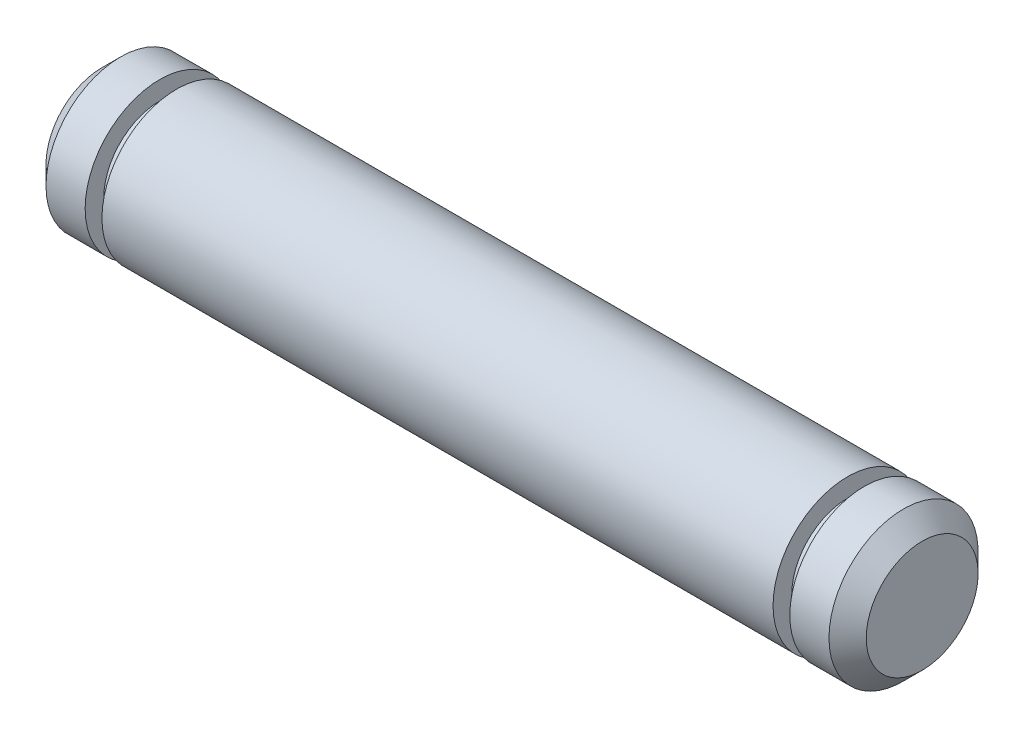
ISO-10303-21;
HEADER;
FILE_DESCRIPTION(('STEP AP214'),'2;1');
FILE_NAME('part.step','',(''),(''),'','','');
FILE_SCHEMA(('AUTOMOTIVE_DESIGN { 1 0 10303 214 1 1 1 1 }'));
ENDSEC;
DATA;
#1=APPLICATION_CONTEXT('core data for automotive mechanical design processes');
#2=APPLICATION_PROTOCOL_DEFINITION('international standard','automotive_design',2000,#1);
#3=PRODUCT_CONTEXT('',#1,'mechanical');
#4=PRODUCT('Part','Part','',(#3));
#5=PRODUCT_RELATED_PRODUCT_CATEGORY('part','',(#4));
#6=PRODUCT_DEFINITION_FORMATION('','',#4);
#7=PRODUCT_DEFINITION_CONTEXT('part definition',#1,'design');
#8=PRODUCT_DEFINITION('design','',#6,#7);
#9=PRODUCT_DEFINITION_SHAPE('','',#8);
#10=(LENGTH_UNIT() NAMED_UNIT(*) SI_UNIT(.MILLI.,.METRE.));
#11=(NAMED_UNIT(*) PLANE_ANGLE_UNIT() SI_UNIT($,.RADIAN.));
#12=(NAMED_UNIT(*) SI_UNIT($,.STERADIAN.) SOLID_ANGLE_UNIT());
#13=UNCERTAINTY_MEASURE_WITH_UNIT(LENGTH_MEASURE(1.E-05),#10,'distance_accuracy_value','');
#14=(GEOMETRIC_REPRESENTATION_CONTEXT(3) GLOBAL_UNCERTAINTY_ASSIGNED_CONTEXT((#13)) GLOBAL_UNIT_ASSIGNED_CONTEXT((#10,
#11,#12)) REPRESENTATION_CONTEXT('',''));
#15=CARTESIAN_POINT('',(0.,0.,0.));
#16=DIRECTION('',(0.,0.,1.));
#17=DIRECTION('',(1.,0.,0.));
#18=AXIS2_PLACEMENT_3D('',#15,#16,#17);
#19=CARTESIAN_POINT('',(0.,0.,0.));
#20=DIRECTION('',(1.,0.,0.));
#21=DIRECTION('',(0.,0.,-1.));
#22=AXIS2_PLACEMENT_3D('',#19,#20,#21);
#23=PLANE('',#22);
#24=CARTESIAN_POINT('',(0.,0.,0.));
#25=DIRECTION('',(1.,0.,0.));
#26=DIRECTION('',(0.,0.,-1.));
#27=AXIS2_PLACEMENT_3D('',#24,#25,#26);
#28=CIRCLE('',#27,3.);
#29=CARTESIAN_POINT('',(0.,0.,-3.));
#30=VERTEX_POINT('',#29);
#31=EDGE_CURVE('E66',#30,#30,#28,.F.);
#32=ORIENTED_EDGE('',*,*,#31,.T.);
#33=EDGE_LOOP('',(#32));
#34=FACE_BOUND('',#33,.T.);
#35=ADVANCED_FACE('F45',(#34),#23,.F.);
#36=CARTESIAN_POINT('',(0.,0.,0.));
#37=DIRECTION('',(-1.,0.,0.));
#38=DIRECTION('',(0.,0.,1.));
#39=AXIS2_PLACEMENT_3D('',#36,#37,#38);
#40=CYLINDRICAL_SURFACE('',#39,4.);
#41=CARTESIAN_POINT('',(1.,0.,0.));
#42=DIRECTION('',(1.,0.,0.));
#43=DIRECTION('',(0.,0.,-1.));
#44=AXIS2_PLACEMENT_3D('',#41,#42,#43);
#45=CIRCLE('',#44,4.);
#46=CARTESIAN_POINT('',(1.,0.,-4.));
#47=VERTEX_POINT('',#46);
#48=EDGE_CURVE('E60',#47,#47,#45,.T.);
#49=ORIENTED_EDGE('',*,*,#48,.T.);
#50=EDGE_LOOP('',(#49));
#51=FACE_BOUND('',#50,.T.);
#52=CARTESIAN_POINT('',(3.1,0.,0.));
#53=DIRECTION('',(-1.,0.,0.));
#54=DIRECTION('',(0.,0.,1.));
#55=AXIS2_PLACEMENT_3D('',#52,#53,#54);
#56=CIRCLE('',#55,4.);
#57=CARTESIAN_POINT('',(3.1,0.,4.));
#58=VERTEX_POINT('',#57);
#59=EDGE_CURVE('E72',#58,#58,#56,.T.);
#60=ORIENTED_EDGE('',*,*,#59,.T.);
#61=EDGE_LOOP('',(#60));
#62=FACE_BOUND('',#61,.T.);
#63=ADVANCED_FACE('F122',(#51,#62),#40,.T.);
#64=CARTESIAN_POINT('',(3.1,4.,0.));
#65=DIRECTION('',(-1.,0.,0.));
#66=DIRECTION('',(0.,0.,1.));
#67=AXIS2_PLACEMENT_3D('',#64,#65,#66);
#68=PLANE('',#67);
#69=ORIENTED_EDGE('',*,*,#59,.F.);
#70=EDGE_LOOP('',(#69));
#71=FACE_BOUND('',#70,.T.);
#72=CARTESIAN_POINT('',(3.1,0.,0.));
#73=DIRECTION('',(-1.,0.,0.));
#74=DIRECTION('',(0.,0.,1.));
#75=AXIS2_PLACEMENT_3D('',#72,#73,#74);
#76=CIRCLE('',#75,3.);
#77=CARTESIAN_POINT('',(3.1,0.,3.));
#78=VERTEX_POINT('',#77);
#79=EDGE_CURVE('E76',#78,#78,#76,.T.);
#80=ORIENTED_EDGE('',*,*,#79,.T.);
#81=EDGE_LOOP('',(#80));
#82=FACE_BOUND('',#81,.T.);
#83=ADVANCED_FACE('F128',(#71,#82),#68,.F.);
#84=CARTESIAN_POINT('',(0.,0.,0.));
#85=DIRECTION('',(-1.,0.,0.));
#86=DIRECTION('',(0.,0.,1.));
#87=AXIS2_PLACEMENT_3D('',#84,#85,#86);
#88=CYLINDRICAL_SURFACE('',#87,3.);
#89=ORIENTED_EDGE('',*,*,#79,.F.);
#90=EDGE_LOOP('',(#89));
#91=FACE_BOUND('',#90,.T.);
#92=CARTESIAN_POINT('',(4.,0.,0.));
#93=DIRECTION('',(-1.,0.,0.));
#94=DIRECTION('',(0.,0.,1.));
#95=AXIS2_PLACEMENT_3D('',#92,#93,#94);
#96=CIRCLE('',#95,3.);
#97=CARTESIAN_POINT('',(4.,0.,3.));
#98=VERTEX_POINT('',#97);
#99=EDGE_CURVE('E80',#98,#98,#96,.T.);
#100=ORIENTED_EDGE('',*,*,#99,.T.);
#101=EDGE_LOOP('',(#100));
#102=FACE_BOUND('',#101,.T.);
#103=ADVANCED_FACE('F149',(#91,#102),#88,.T.);
#104=CARTESIAN_POINT('',(4.,3.,0.));
#105=DIRECTION('',(1.,0.,0.));
#106=DIRECTION('',(0.,0.,-1.));
#107=AXIS2_PLACEMENT_3D('',#104,#105,#106);
#108=PLANE('',#107);
#109=ORIENTED_EDGE('',*,*,#99,.F.);
#110=EDGE_LOOP('',(#109));
#111=FACE_BOUND('',#110,.T.);
#112=CARTESIAN_POINT('',(4.,0.,0.));
#113=DIRECTION('',(-1.,0.,0.));
#114=DIRECTION('',(0.,0.,1.));
#115=AXIS2_PLACEMENT_3D('',#112,#113,#114);
#116=CIRCLE('',#115,4.);
#117=CARTESIAN_POINT('',(4.,0.,4.));
#118=VERTEX_POINT('',#117);
#119=EDGE_CURVE('E84',#118,#118,#116,.T.);
#120=ORIENTED_EDGE('',*,*,#119,.T.);
#121=EDGE_LOOP('',(#120));
#122=FACE_BOUND('',#121,.T.);
#123=ADVANCED_FACE('F154',(#111,#122),#108,.F.);
#124=CARTESIAN_POINT('',(0.,0.,0.));
#125=DIRECTION('',(-1.,0.,0.));
#126=DIRECTION('',(0.,0.,1.));
#127=AXIS2_PLACEMENT_3D('',#124,#125,#126);
#128=CYLINDRICAL_SURFACE('',#127,4.);
#129=ORIENTED_EDGE('',*,*,#119,.F.);
#130=EDGE_LOOP('',(#129));
#131=FACE_BOUND('',#130,.T.);
#132=CARTESIAN_POINT('',(40.,0.,0.));
#133=DIRECTION('',(-1.,0.,0.));
#134=DIRECTION('',(0.,0.,1.));
#135=AXIS2_PLACEMENT_3D('',#132,#133,#134);
#136=CIRCLE('',#135,4.);
#137=CARTESIAN_POINT('',(40.,0.,4.));
#138=VERTEX_POINT('',#137);
#139=EDGE_CURVE('E88',#138,#138,#136,.T.);
#140=ORIENTED_EDGE('',*,*,#139,.T.);
#141=EDGE_LOOP('',(#140));
#142=FACE_BOUND('',#141,.T.);
#143=ADVANCED_FACE('F160',(#131,#142),#128,.T.);
#144=CARTESIAN_POINT('',(40.,4.,0.));
#145=DIRECTION('',(-1.,0.,0.));
#146=DIRECTION('',(0.,0.,1.));
#147=AXIS2_PLACEMENT_3D('',#144,#145,#146);
#148=PLANE('',#147);
#149=ORIENTED_EDGE('',*,*,#139,.F.);
#150=EDGE_LOOP('',(#149));
#151=FACE_BOUND('',#150,.T.);
#152=CARTESIAN_POINT('',(40.,0.,0.));
#153=DIRECTION('',(-1.,0.,0.));
#154=DIRECTION('',(0.,0.,1.));
#155=AXIS2_PLACEMENT_3D('',#152,#153,#154);
#156=CIRCLE('',#155,3.);
#157=CARTESIAN_POINT('',(40.,0.,3.));
#158=VERTEX_POINT('',#157);
#159=EDGE_CURVE('E92',#158,#158,#156,.T.);
#160=ORIENTED_EDGE('',*,*,#159,.T.);
#161=EDGE_LOOP('',(#160));
#162=FACE_BOUND('',#161,.T.);
#163=ADVANCED_FACE('F166',(#151,#162),#148,.F.);
#164=CARTESIAN_POINT('',(0.,0.,0.));
#165=DIRECTION('',(-1.,0.,0.));
#166=DIRECTION('',(0.,0.,1.));
#167=AXIS2_PLACEMENT_3D('',#164,#165,#166);
#168=CYLINDRICAL_SURFACE('',#167,3.);
#169=ORIENTED_EDGE('',*,*,#159,.F.);
#170=EDGE_LOOP('',(#169));
#171=FACE_BOUND('',#170,.T.);
#172=CARTESIAN_POINT('',(40.9,0.,0.));
#173=DIRECTION('',(-1.,0.,0.));
#174=DIRECTION('',(0.,0.,1.));
#175=AXIS2_PLACEMENT_3D('',#172,#173,#174);
#176=CIRCLE('',#175,3.);
#177=CARTESIAN_POINT('',(40.9,0.,3.));
#178=VERTEX_POINT('',#177);
#179=EDGE_CURVE('E96',#178,#178,#176,.T.);
#180=ORIENTED_EDGE('',*,*,#179,.T.);
#181=EDGE_LOOP('',(#180));
#182=FACE_BOUND('',#181,.T.);
#183=ADVANCED_FACE('F118',(#171,#182),#168,.T.);
#184=CARTESIAN_POINT('',(40.9,3.,0.));
#185=DIRECTION('',(1.,0.,0.));
#186=DIRECTION('',(0.,0.,-1.));
#187=AXIS2_PLACEMENT_3D('',#184,#185,#186);
#188=PLANE('',#187);
#189=ORIENTED_EDGE('',*,*,#179,.F.);
#190=EDGE_LOOP('',(#189));
#191=FACE_BOUND('',#190,.T.);
#192=CARTESIAN_POINT('',(40.9,0.,0.));
#193=DIRECTION('',(-1.,0.,0.));
#194=DIRECTION('',(0.,0.,1.));
#195=AXIS2_PLACEMENT_3D('',#192,#193,#194);
#196=CIRCLE('',#195,4.);
#197=CARTESIAN_POINT('',(40.9,0.,4.));
#198=VERTEX_POINT('',#197);
#199=EDGE_CURVE('E100',#198,#198,#196,.T.);
#200=ORIENTED_EDGE('',*,*,#199,.T.);
#201=EDGE_LOOP('',(#200));
#202=FACE_BOUND('',#201,.T.);
#203=ADVANCED_FACE('F106',(#191,#202),#188,.F.);
#204=CARTESIAN_POINT('',(0.,0.,0.));
#205=DIRECTION('',(-1.,0.,0.));
#206=DIRECTION('',(0.,0.,1.));
#207=AXIS2_PLACEMENT_3D('',#204,#205,#206);
#208=CYLINDRICAL_SURFACE('',#207,4.);
#209=CARTESIAN_POINT('',(43.,0.,0.));
#210=DIRECTION('',(-1.,0.,0.));
#211=DIRECTION('',(0.,0.,1.));
#212=AXIS2_PLACEMENT_3D('',#209,#210,#211);
#213=CIRCLE('',#212,4.);
#214=CARTESIAN_POINT('',(43.,0.,4.));
#215=VERTEX_POINT('',#214);
#216=EDGE_CURVE('E54',#215,#215,#213,.T.);
#217=ORIENTED_EDGE('',*,*,#216,.T.);
#218=EDGE_LOOP('',(#217));
#219=FACE_BOUND('',#218,.T.);
#220=ORIENTED_EDGE('',*,*,#199,.F.);
#221=EDGE_LOOP('',(#220));
#222=FACE_BOUND('',#221,.T.);
#223=ADVANCED_FACE('F108',(#219,#222),#208,.T.);
#224=CARTESIAN_POINT('',(44.,4.,0.));
#225=DIRECTION('',(-1.,0.,0.));
#226=DIRECTION('',(0.,0.,1.));
#227=AXIS2_PLACEMENT_3D('',#224,#225,#226);
#228=PLANE('',#227);
#229=CARTESIAN_POINT('',(44.,0.,0.));
#230=DIRECTION('',(-1.,0.,0.));
#231=DIRECTION('',(0.,0.,1.));
#232=AXIS2_PLACEMENT_3D('',#229,#230,#231);
#233=CIRCLE('',#232,2.99999999999999);
#234=CARTESIAN_POINT('',(44.,0.,2.99999999999999));
#235=VERTEX_POINT('',#234);
#236=EDGE_CURVE('E10',#235,#235,#233,.F.);
#237=ORIENTED_EDGE('',*,*,#236,.T.);
#238=EDGE_LOOP('',(#237));
#239=FACE_BOUND('',#238,.T.);
#240=ADVANCED_FACE('F110',(#239),#228,.F.);
#241=CARTESIAN_POINT('',(0.,0.,0.));
#242=DIRECTION('',(1.,0.,0.));
#243=DIRECTION('',(0.,0.,-1.));
#244=AXIS2_PLACEMENT_3D('',#241,#242,#243);
#245=CONICAL_SURFACE('',#244,3.,0.785398163397448);
#246=ORIENTED_EDGE('',*,*,#48,.F.);
#247=EDGE_LOOP('',(#246));
#248=FACE_BOUND('',#247,.T.);
#249=ORIENTED_EDGE('',*,*,#31,.F.);
#250=EDGE_LOOP('',(#249));
#251=FACE_BOUND('',#250,.T.);
#252=ADVANCED_FACE('F116',(#248,#251),#245,.T.);
#253=CARTESIAN_POINT('',(43.,0.,0.));
#254=DIRECTION('',(-1.,0.,0.));
#255=DIRECTION('',(0.,0.,1.));
#256=AXIS2_PLACEMENT_3D('',#253,#254,#255);
#257=CONICAL_SURFACE('',#256,4.,0.785398163397445);
#258=ORIENTED_EDGE('',*,*,#236,.F.);
#259=EDGE_LOOP('',(#258));
#260=FACE_BOUND('',#259,.T.);
#261=ORIENTED_EDGE('',*,*,#216,.F.);
#262=EDGE_LOOP('',(#261));
#263=FACE_BOUND('',#262,.T.);
#264=ADVANCED_FACE('F48',(#260,#263),#257,.T.);
#265=CLOSED_SHELL('',(#35,#63,#83,#103,#123,#143,#163,#183,#203,#223,#240,#252,#264));
#266=MANIFOLD_SOLID_BREP('B2',#265);
#267=ADVANCED_BREP_SHAPE_REPRESENTATION('',(#18,#266),#14);
#268=SHAPE_DEFINITION_REPRESENTATION(#9,#267);
ENDSEC;
END-ISO-10303-21;
